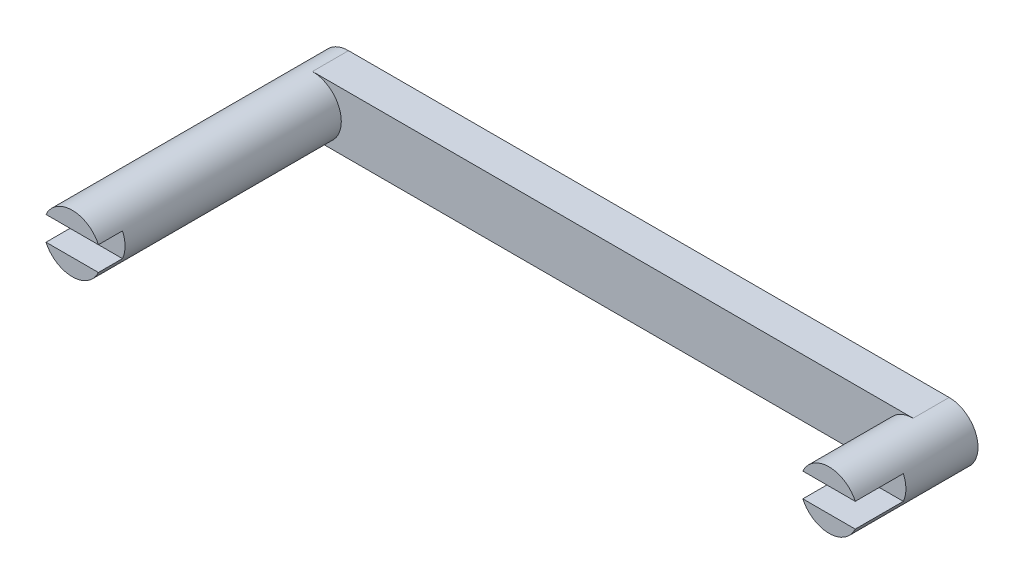
ISO-10303-21;
HEADER;
FILE_DESCRIPTION(('STEP AP214'),'2;1');
FILE_NAME('part.step','',(''),(''),'','','');
FILE_SCHEMA(('AUTOMOTIVE_DESIGN { 1 0 10303 214 1 1 1 1 }'));
ENDSEC;
DATA;
#1=APPLICATION_CONTEXT('core data for automotive mechanical design processes');
#2=APPLICATION_PROTOCOL_DEFINITION('international standard','automotive_design',2000,#1);
#3=PRODUCT_CONTEXT('',#1,'mechanical');
#4=PRODUCT('Part','Part','',(#3));
#5=PRODUCT_RELATED_PRODUCT_CATEGORY('part','',(#4));
#6=PRODUCT_DEFINITION_FORMATION('','',#4);
#7=PRODUCT_DEFINITION_CONTEXT('part definition',#1,'design');
#8=PRODUCT_DEFINITION('design','',#6,#7);
#9=PRODUCT_DEFINITION_SHAPE('','',#8);
#10=(LENGTH_UNIT() NAMED_UNIT(*) SI_UNIT(.MILLI.,.METRE.));
#11=(NAMED_UNIT(*) PLANE_ANGLE_UNIT() SI_UNIT($,.RADIAN.));
#12=(NAMED_UNIT(*) SI_UNIT($,.STERADIAN.) SOLID_ANGLE_UNIT());
#13=UNCERTAINTY_MEASURE_WITH_UNIT(LENGTH_MEASURE(1.E-05),#10,'distance_accuracy_value','');
#14=(GEOMETRIC_REPRESENTATION_CONTEXT(3) GLOBAL_UNCERTAINTY_ASSIGNED_CONTEXT((#13)) GLOBAL_UNIT_ASSIGNED_CONTEXT((#10,
#11,#12)) REPRESENTATION_CONTEXT('',''));
#15=CARTESIAN_POINT('',(0.,0.,0.));
#16=DIRECTION('',(0.,0.,1.));
#17=DIRECTION('',(1.,0.,0.));
#18=AXIS2_PLACEMENT_3D('',#15,#16,#17);
#19=CARTESIAN_POINT('',(0.,0.,10.));
#20=DIRECTION('',(0.,0.,1.));
#21=DIRECTION('',(1.,0.,0.));
#22=AXIS2_PLACEMENT_3D('',#19,#20,#21);
#23=PLANE('',#22);
#24=CARTESIAN_POINT('',(50.,0.,10.));
#25=DIRECTION('',(0.,0.,1.));
#26=DIRECTION('',(1.,0.,0.));
#27=AXIS2_PLACEMENT_3D('',#24,#25,#26);
#28=CIRCLE('',#27,2.4);
#29=CARTESIAN_POINT('',(52.1817424229272,1.,10.));
#30=VERTEX_POINT('',#29);
#31=CARTESIAN_POINT('',(47.8182575770729,1.,10.));
#32=VERTEX_POINT('',#31);
#33=EDGE_CURVE('E158',#30,#32,#28,.T.);
#34=ORIENTED_EDGE('',*,*,#33,.T.);
#35=DIRECTION('',(1.,0.,0.));
#36=VECTOR('',#35,1.);
#37=CARTESIAN_POINT('',(0.,1.,10.));
#38=LINE('',#37,#36);
#39=EDGE_CURVE('E133',#32,#30,#38,.T.);
#40=ORIENTED_EDGE('',*,*,#39,.T.);
#41=EDGE_LOOP('',(#34,#40));
#42=FACE_BOUND('',#41,.T.);
#43=ADVANCED_FACE('F41',(#42),#23,.T.);
#44=CARTESIAN_POINT('',(0.,0.,3.));
#45=DIRECTION('',(0.,0.,1.));
#46=DIRECTION('',(1.,0.,0.));
#47=AXIS2_PLACEMENT_3D('',#44,#45,#46);
#48=PLANE('',#47);
#49=DIRECTION('',(1.,0.,0.));
#50=VECTOR('',#49,1.);
#51=CARTESIAN_POINT('',(0.,-2.4,3.));
#52=LINE('',#51,#50);
#53=CARTESIAN_POINT('',(0.,-2.4,3.));
#54=VERTEX_POINT('',#53);
#55=CARTESIAN_POINT('',(50.,-2.4,3.));
#56=VERTEX_POINT('',#55);
#57=EDGE_CURVE('E188',#54,#56,#52,.T.);
#58=ORIENTED_EDGE('',*,*,#57,.T.);
#59=CARTESIAN_POINT('',(50.,0.,3.));
#60=DIRECTION('',(0.,0.,1.));
#61=DIRECTION('',(1.,0.,0.));
#62=AXIS2_PLACEMENT_3D('',#59,#60,#61);
#63=CIRCLE('',#62,2.4);
#64=CARTESIAN_POINT('',(50.,2.4,3.));
#65=VERTEX_POINT('',#64);
#66=EDGE_CURVE('E162',#56,#65,#63,.F.);
#67=ORIENTED_EDGE('',*,*,#66,.T.);
#68=DIRECTION('',(-1.,0.,0.));
#69=VECTOR('',#68,1.);
#70=CARTESIAN_POINT('',(0.,2.4,3.));
#71=LINE('',#70,#69);
#72=CARTESIAN_POINT('',(0.,2.4,3.));
#73=VERTEX_POINT('',#72);
#74=EDGE_CURVE('E190',#65,#73,#71,.T.);
#75=ORIENTED_EDGE('',*,*,#74,.T.);
#76=CARTESIAN_POINT('',(0.,0.,3.));
#77=DIRECTION('',(0.,0.,1.));
#78=DIRECTION('',(1.,0.,0.));
#79=AXIS2_PLACEMENT_3D('',#76,#77,#78);
#80=CIRCLE('',#79,2.4);
#81=EDGE_CURVE('E185',#73,#54,#80,.F.);
#82=ORIENTED_EDGE('',*,*,#81,.T.);
#83=EDGE_LOOP('',(#58,#67,#75,#82));
#84=FACE_BOUND('',#83,.T.);
#85=ADVANCED_FACE('F237',(#84),#48,.T.);
#86=CARTESIAN_POINT('',(0.,0.,23.));
#87=DIRECTION('',(0.,0.,1.));
#88=DIRECTION('',(1.,0.,0.));
#89=AXIS2_PLACEMENT_3D('',#86,#87,#88);
#90=PLANE('',#89);
#91=DIRECTION('',(1.,0.,0.));
#92=VECTOR('',#91,1.);
#93=CARTESIAN_POINT('',(0.,-1.,23.));
#94=LINE('',#93,#92);
#95=CARTESIAN_POINT('',(-2.18174242292714,-1.,23.));
#96=VERTEX_POINT('',#95);
#97=CARTESIAN_POINT('',(2.18174242292714,-1.,23.));
#98=VERTEX_POINT('',#97);
#99=EDGE_CURVE('E215',#96,#98,#94,.T.);
#100=ORIENTED_EDGE('',*,*,#99,.F.);
#101=CARTESIAN_POINT('',(0.,0.,23.));
#102=DIRECTION('',(0.,0.,1.));
#103=DIRECTION('',(1.,0.,0.));
#104=AXIS2_PLACEMENT_3D('',#101,#102,#103);
#105=CIRCLE('',#104,2.4);
#106=EDGE_CURVE('E181',#96,#98,#105,.T.);
#107=ORIENTED_EDGE('',*,*,#106,.T.);
#108=EDGE_LOOP('',(#100,#107));
#109=FACE_BOUND('',#108,.T.);
#110=ADVANCED_FACE('F242',(#109),#90,.T.);
#111=CARTESIAN_POINT('',(0.,-2.4,3.));
#112=DIRECTION('',(0.,1.,0.));
#113=DIRECTION('',(0.,0.,1.));
#114=AXIS2_PLACEMENT_3D('',#111,#112,#113);
#115=PLANE('',#114);
#116=DIRECTION('',(1.,0.,0.));
#117=VECTOR('',#116,1.);
#118=CARTESIAN_POINT('',(0.,-2.4,0.));
#119=LINE('',#118,#117);
#120=CARTESIAN_POINT('',(0.,-2.4,0.));
#121=VERTEX_POINT('',#120);
#122=CARTESIAN_POINT('',(50.,-2.4,0.));
#123=VERTEX_POINT('',#122);
#124=EDGE_CURVE('E187',#121,#123,#119,.T.);
#125=ORIENTED_EDGE('',*,*,#124,.T.);
#126=DIRECTION('',(0.,0.,-1.));
#127=VECTOR('',#126,1.);
#128=CARTESIAN_POINT('',(50.,-2.4,3.));
#129=LINE('',#128,#127);
#130=EDGE_CURVE('E210',#56,#123,#129,.T.);
#131=ORIENTED_EDGE('',*,*,#130,.F.);
#132=ORIENTED_EDGE('',*,*,#57,.F.);
#133=DIRECTION('',(0.,0.,-1.));
#134=VECTOR('',#133,1.);
#135=CARTESIAN_POINT('',(0.,-2.4,3.));
#136=LINE('',#135,#134);
#137=EDGE_CURVE('E194',#54,#121,#136,.T.);
#138=ORIENTED_EDGE('',*,*,#137,.T.);
#139=EDGE_LOOP('',(#125,#131,#132,#138));
#140=FACE_BOUND('',#139,.T.);
#141=ADVANCED_FACE('F43',(#140),#115,.F.);
#142=CARTESIAN_POINT('',(50.,0.,3.));
#143=DIRECTION('',(0.,0.,-1.));
#144=DIRECTION('',(-1.,0.,0.));
#145=AXIS2_PLACEMENT_3D('',#142,#143,#144);
#146=CYLINDRICAL_SURFACE('',#145,2.4);
#147=CARTESIAN_POINT('',(47.8182575770729,-1.,10.));
#148=VERTEX_POINT('',#147);
#149=CARTESIAN_POINT('',(52.1817424229272,-1.,10.));
#150=VERTEX_POINT('',#149);
#151=EDGE_CURVE('E154',#148,#150,#28,.T.);
#152=ORIENTED_EDGE('',*,*,#151,.F.);
#153=DIRECTION('',(0.,0.,-1.));
#154=VECTOR('',#153,1.);
#155=CARTESIAN_POINT('',(47.8182575770729,-1.,3.));
#156=LINE('',#155,#154);
#157=CARTESIAN_POINT('',(47.8182575770729,-1.,6.));
#158=VERTEX_POINT('',#157);
#159=EDGE_CURVE('E151',#148,#158,#156,.T.);
#160=ORIENTED_EDGE('',*,*,#159,.T.);
#161=CARTESIAN_POINT('',(50.,0.,6.));
#162=DIRECTION('',(0.,0.,1.));
#163=DIRECTION('',(1.,0.,0.));
#164=AXIS2_PLACEMENT_3D('',#161,#162,#163);
#165=CIRCLE('',#164,2.4);
#166=CARTESIAN_POINT('',(47.8182575770729,1.,6.));
#167=VERTEX_POINT('',#166);
#168=EDGE_CURVE('E11',#167,#158,#165,.T.);
#169=ORIENTED_EDGE('',*,*,#168,.F.);
#170=DIRECTION('',(0.,0.,-1.));
#171=VECTOR('',#170,1.);
#172=CARTESIAN_POINT('',(47.8182575770729,1.,3.));
#173=LINE('',#172,#171);
#174=EDGE_CURVE('E129',#32,#167,#173,.T.);
#175=ORIENTED_EDGE('',*,*,#174,.F.);
#176=ORIENTED_EDGE('',*,*,#33,.F.);
#177=DIRECTION('',(0.,0.,-1.));
#178=VECTOR('',#177,1.);
#179=CARTESIAN_POINT('',(52.1817424229272,1.,3.));
#180=LINE('',#179,#178);
#181=CARTESIAN_POINT('',(52.1817424229272,1.,6.));
#182=VERTEX_POINT('',#181);
#183=EDGE_CURVE('E56',#182,#30,#180,.F.);
#184=ORIENTED_EDGE('',*,*,#183,.F.);
#185=CARTESIAN_POINT('',(52.1817424229272,-1.,6.));
#186=VERTEX_POINT('',#185);
#187=EDGE_CURVE('E45',#186,#182,#165,.T.);
#188=ORIENTED_EDGE('',*,*,#187,.F.);
#189=DIRECTION('',(0.,0.,-1.));
#190=VECTOR('',#189,1.);
#191=CARTESIAN_POINT('',(52.1817424229272,-1.,3.));
#192=LINE('',#191,#190);
#193=EDGE_CURVE('E138',#186,#150,#192,.F.);
#194=ORIENTED_EDGE('',*,*,#193,.T.);
#195=EDGE_LOOP('',(#152,#160,#169,#175,#176,#184,#188,#194));
#196=FACE_BOUND('',#195,.T.);
#197=CARTESIAN_POINT('',(50.,0.,0.));
#198=DIRECTION('',(0.,0.,1.));
#199=DIRECTION('',(1.,0.,0.));
#200=AXIS2_PLACEMENT_3D('',#197,#198,#199);
#201=CIRCLE('',#200,2.4);
#202=CARTESIAN_POINT('',(50.,2.4,0.));
#203=VERTEX_POINT('',#202);
#204=EDGE_CURVE('E197',#123,#203,#201,.T.);
#205=ORIENTED_EDGE('',*,*,#204,.T.);
#206=DIRECTION('',(0.,0.,-1.));
#207=VECTOR('',#206,1.);
#208=CARTESIAN_POINT('',(50.,2.4,3.));
#209=LINE('',#208,#207);
#210=EDGE_CURVE('E207',#65,#203,#209,.T.);
#211=ORIENTED_EDGE('',*,*,#210,.F.);
#212=ORIENTED_EDGE('',*,*,#66,.F.);
#213=ORIENTED_EDGE('',*,*,#130,.T.);
#214=EDGE_LOOP('',(#205,#211,#212,#213));
#215=FACE_BOUND('',#214,.T.);
#216=ADVANCED_FACE('F149',(#196,#215),#146,.T.);
#217=CARTESIAN_POINT('',(0.,2.4,3.));
#218=DIRECTION('',(0.,-1.,0.));
#219=DIRECTION('',(0.,0.,-1.));
#220=AXIS2_PLACEMENT_3D('',#217,#218,#219);
#221=PLANE('',#220);
#222=DIRECTION('',(-1.,0.,0.));
#223=VECTOR('',#222,1.);
#224=CARTESIAN_POINT('',(0.,2.4,0.));
#225=LINE('',#224,#223);
#226=CARTESIAN_POINT('',(0.,2.4,0.));
#227=VERTEX_POINT('',#226);
#228=EDGE_CURVE('E199',#203,#227,#225,.T.);
#229=ORIENTED_EDGE('',*,*,#228,.T.);
#230=DIRECTION('',(0.,0.,-1.));
#231=VECTOR('',#230,1.);
#232=CARTESIAN_POINT('',(0.,2.4,3.));
#233=LINE('',#232,#231);
#234=EDGE_CURVE('E204',#73,#227,#233,.T.);
#235=ORIENTED_EDGE('',*,*,#234,.F.);
#236=ORIENTED_EDGE('',*,*,#74,.F.);
#237=ORIENTED_EDGE('',*,*,#210,.T.);
#238=EDGE_LOOP('',(#229,#235,#236,#237));
#239=FACE_BOUND('',#238,.T.);
#240=ADVANCED_FACE('F261',(#239),#221,.F.);
#241=CARTESIAN_POINT('',(0.,0.,3.));
#242=DIRECTION('',(0.,0.,-1.));
#243=DIRECTION('',(-1.,0.,0.));
#244=AXIS2_PLACEMENT_3D('',#241,#242,#243);
#245=CYLINDRICAL_SURFACE('',#244,2.4);
#246=ORIENTED_EDGE('',*,*,#106,.F.);
#247=DIRECTION('',(0.,0.,-1.));
#248=VECTOR('',#247,1.);
#249=CARTESIAN_POINT('',(-2.18174242292714,-1.,3.));
#250=LINE('',#249,#248);
#251=CARTESIAN_POINT('',(-2.18174242292714,-1.,21.));
#252=VERTEX_POINT('',#251);
#253=EDGE_CURVE('E178',#96,#252,#250,.T.);
#254=ORIENTED_EDGE('',*,*,#253,.T.);
#255=CARTESIAN_POINT('',(0.,0.,21.));
#256=DIRECTION('',(0.,0.,1.));
#257=DIRECTION('',(1.,0.,0.));
#258=AXIS2_PLACEMENT_3D('',#255,#256,#257);
#259=CIRCLE('',#258,2.4);
#260=CARTESIAN_POINT('',(-2.18174242292714,1.,21.));
#261=VERTEX_POINT('',#260);
#262=EDGE_CURVE('E219',#261,#252,#259,.T.);
#263=ORIENTED_EDGE('',*,*,#262,.F.);
#264=DIRECTION('',(0.,0.,-1.));
#265=VECTOR('',#264,1.);
#266=CARTESIAN_POINT('',(-2.18174242292714,1.,3.));
#267=LINE('',#266,#265);
#268=CARTESIAN_POINT('',(-2.18174242292714,1.,23.));
#269=VERTEX_POINT('',#268);
#270=EDGE_CURVE('E171',#261,#269,#267,.F.);
#271=ORIENTED_EDGE('',*,*,#270,.T.);
#272=CARTESIAN_POINT('',(2.18174242292714,1.,23.));
#273=VERTEX_POINT('',#272);
#274=EDGE_CURVE('E182',#273,#269,#105,.T.);
#275=ORIENTED_EDGE('',*,*,#274,.F.);
#276=DIRECTION('',(0.,0.,-1.));
#277=VECTOR('',#276,1.);
#278=CARTESIAN_POINT('',(2.18174242292714,1.,3.));
#279=LINE('',#278,#277);
#280=CARTESIAN_POINT('',(2.18174242292714,1.,21.));
#281=VERTEX_POINT('',#280);
#282=EDGE_CURVE('E64',#273,#281,#279,.T.);
#283=ORIENTED_EDGE('',*,*,#282,.T.);
#284=CARTESIAN_POINT('',(2.18174242292714,-1.,21.));
#285=VERTEX_POINT('',#284);
#286=EDGE_CURVE('E217',#285,#281,#259,.T.);
#287=ORIENTED_EDGE('',*,*,#286,.F.);
#288=DIRECTION('',(0.,0.,-1.));
#289=VECTOR('',#288,1.);
#290=CARTESIAN_POINT('',(2.18174242292714,-1.,3.));
#291=LINE('',#290,#289);
#292=EDGE_CURVE('E175',#285,#98,#291,.F.);
#293=ORIENTED_EDGE('',*,*,#292,.T.);
#294=EDGE_LOOP('',(#246,#254,#263,#271,#275,#283,#287,#293));
#295=FACE_BOUND('',#294,.T.);
#296=CARTESIAN_POINT('',(0.,0.,0.));
#297=DIRECTION('',(0.,0.,1.));
#298=DIRECTION('',(1.,0.,0.));
#299=AXIS2_PLACEMENT_3D('',#296,#297,#298);
#300=CIRCLE('',#299,2.4);
#301=EDGE_CURVE('E191',#227,#121,#300,.T.);
#302=ORIENTED_EDGE('',*,*,#301,.T.);
#303=ORIENTED_EDGE('',*,*,#137,.F.);
#304=ORIENTED_EDGE('',*,*,#81,.F.);
#305=ORIENTED_EDGE('',*,*,#234,.T.);
#306=EDGE_LOOP('',(#302,#303,#304,#305));
#307=FACE_BOUND('',#306,.T.);
#308=ADVANCED_FACE('F257',(#295,#307),#245,.T.);
#309=CARTESIAN_POINT('',(0.,0.,0.));
#310=DIRECTION('',(0.,0.,1.));
#311=DIRECTION('',(1.,0.,0.));
#312=AXIS2_PLACEMENT_3D('',#309,#310,#311);
#313=PLANE('',#312);
#314=ORIENTED_EDGE('',*,*,#204,.F.);
#315=ORIENTED_EDGE('',*,*,#124,.F.);
#316=ORIENTED_EDGE('',*,*,#301,.F.);
#317=ORIENTED_EDGE('',*,*,#228,.F.);
#318=EDGE_LOOP('',(#314,#315,#316,#317));
#319=FACE_BOUND('',#318,.T.);
#320=ADVANCED_FACE('F254',(#319),#313,.F.);
#321=DIRECTION('',(-1.,0.,0.));
#322=VECTOR('',#321,1.);
#323=CARTESIAN_POINT('',(0.,1.,23.));
#324=LINE('',#323,#322);
#325=EDGE_CURVE('E213',#273,#269,#324,.T.);
#326=ORIENTED_EDGE('',*,*,#325,.F.);
#327=ORIENTED_EDGE('',*,*,#274,.T.);
#328=EDGE_LOOP('',(#326,#327));
#329=FACE_BOUND('',#328,.T.);
#330=ADVANCED_FACE('F252',(#329),#90,.T.);
#331=CARTESIAN_POINT('',(0.,0.,21.));
#332=DIRECTION('',(0.,0.,1.));
#333=DIRECTION('',(1.,0.,0.));
#334=AXIS2_PLACEMENT_3D('',#331,#332,#333);
#335=PLANE('',#334);
#336=ORIENTED_EDGE('',*,*,#262,.T.);
#337=DIRECTION('',(1.,0.,0.));
#338=VECTOR('',#337,1.);
#339=CARTESIAN_POINT('',(-2.5,-1.,21.));
#340=LINE('',#339,#338);
#341=EDGE_CURVE('E168',#252,#285,#340,.T.);
#342=ORIENTED_EDGE('',*,*,#341,.T.);
#343=ORIENTED_EDGE('',*,*,#286,.T.);
#344=DIRECTION('',(-1.,0.,0.));
#345=VECTOR('',#344,1.);
#346=CARTESIAN_POINT('',(-2.5,1.,21.));
#347=LINE('',#346,#345);
#348=EDGE_CURVE('E165',#281,#261,#347,.T.);
#349=ORIENTED_EDGE('',*,*,#348,.T.);
#350=EDGE_LOOP('',(#336,#342,#343,#349));
#351=FACE_BOUND('',#350,.T.);
#352=ADVANCED_FACE('F368',(#351),#335,.T.);
#353=CARTESIAN_POINT('',(-2.5,-1.,21.));
#354=DIRECTION('',(0.,-1.,0.));
#355=DIRECTION('',(0.,0.,-1.));
#356=AXIS2_PLACEMENT_3D('',#353,#354,#355);
#357=PLANE('',#356);
#358=ORIENTED_EDGE('',*,*,#99,.T.);
#359=ORIENTED_EDGE('',*,*,#292,.F.);
#360=ORIENTED_EDGE('',*,*,#341,.F.);
#361=ORIENTED_EDGE('',*,*,#253,.F.);
#362=EDGE_LOOP('',(#358,#359,#360,#361));
#363=FACE_BOUND('',#362,.T.);
#364=ADVANCED_FACE('F232',(#363),#357,.F.);
#365=CARTESIAN_POINT('',(-2.5,1.,21.));
#366=DIRECTION('',(0.,1.,0.));
#367=DIRECTION('',(0.,0.,1.));
#368=AXIS2_PLACEMENT_3D('',#365,#366,#367);
#369=PLANE('',#368);
#370=ORIENTED_EDGE('',*,*,#325,.T.);
#371=ORIENTED_EDGE('',*,*,#270,.F.);
#372=ORIENTED_EDGE('',*,*,#348,.F.);
#373=ORIENTED_EDGE('',*,*,#282,.F.);
#374=EDGE_LOOP('',(#370,#371,#372,#373));
#375=FACE_BOUND('',#374,.T.);
#376=ADVANCED_FACE('F225',(#375),#369,.F.);
#377=DIRECTION('',(1.,0.,0.));
#378=VECTOR('',#377,1.);
#379=CARTESIAN_POINT('',(0.,-1.,10.));
#380=LINE('',#379,#378);
#381=EDGE_CURVE('E220',#148,#150,#380,.T.);
#382=ORIENTED_EDGE('',*,*,#381,.F.);
#383=ORIENTED_EDGE('',*,*,#151,.T.);
#384=EDGE_LOOP('',(#382,#383));
#385=FACE_BOUND('',#384,.T.);
#386=ADVANCED_FACE('F223',(#385),#23,.T.);
#387=CARTESIAN_POINT('',(0.,0.,6.));
#388=DIRECTION('',(0.,0.,1.));
#389=DIRECTION('',(1.,0.,0.));
#390=AXIS2_PLACEMENT_3D('',#387,#388,#389);
#391=PLANE('',#390);
#392=ORIENTED_EDGE('',*,*,#168,.T.);
#393=DIRECTION('',(1.,0.,0.));
#394=VECTOR('',#393,1.);
#395=CARTESIAN_POINT('',(0.,-1.,6.));
#396=LINE('',#395,#394);
#397=EDGE_CURVE('E145',#158,#186,#396,.T.);
#398=ORIENTED_EDGE('',*,*,#397,.T.);
#399=ORIENTED_EDGE('',*,*,#187,.T.);
#400=DIRECTION('',(1.,0.,0.));
#401=VECTOR('',#400,1.);
#402=CARTESIAN_POINT('',(0.,1.,6.));
#403=LINE('',#402,#401);
#404=EDGE_CURVE('E132',#167,#182,#403,.T.);
#405=ORIENTED_EDGE('',*,*,#404,.F.);
#406=EDGE_LOOP('',(#392,#398,#399,#405));
#407=FACE_BOUND('',#406,.T.);
#408=ADVANCED_FACE('F141',(#407),#391,.T.);
#409=CARTESIAN_POINT('',(0.,-1.,6.));
#410=DIRECTION('',(0.,-1.,0.));
#411=DIRECTION('',(0.,0.,-1.));
#412=AXIS2_PLACEMENT_3D('',#409,#410,#411);
#413=PLANE('',#412);
#414=ORIENTED_EDGE('',*,*,#381,.T.);
#415=ORIENTED_EDGE('',*,*,#193,.F.);
#416=ORIENTED_EDGE('',*,*,#397,.F.);
#417=ORIENTED_EDGE('',*,*,#159,.F.);
#418=EDGE_LOOP('',(#414,#415,#416,#417));
#419=FACE_BOUND('',#418,.T.);
#420=ADVANCED_FACE('F221',(#419),#413,.F.);
#421=CARTESIAN_POINT('',(0.,1.,6.));
#422=DIRECTION('',(0.,-1.,0.));
#423=DIRECTION('',(0.,0.,-1.));
#424=AXIS2_PLACEMENT_3D('',#421,#422,#423);
#425=PLANE('',#424);
#426=ORIENTED_EDGE('',*,*,#174,.T.);
#427=ORIENTED_EDGE('',*,*,#404,.T.);
#428=ORIENTED_EDGE('',*,*,#183,.T.);
#429=ORIENTED_EDGE('',*,*,#39,.F.);
#430=EDGE_LOOP('',(#426,#427,#428,#429));
#431=FACE_BOUND('',#430,.T.);
#432=ADVANCED_FACE('F131',(#431),#425,.T.);
#433=CLOSED_SHELL('',(#43,#85,#110,#141,#216,#240,#308,#320,#330,#352,#364,#376,#386,#408,#420,#432));
#434=MANIFOLD_SOLID_BREP('B2',#433);
#435=ADVANCED_BREP_SHAPE_REPRESENTATION('',(#18,#434),#14);
#436=SHAPE_DEFINITION_REPRESENTATION(#9,#435);
ENDSEC;
END-ISO-10303-21;
